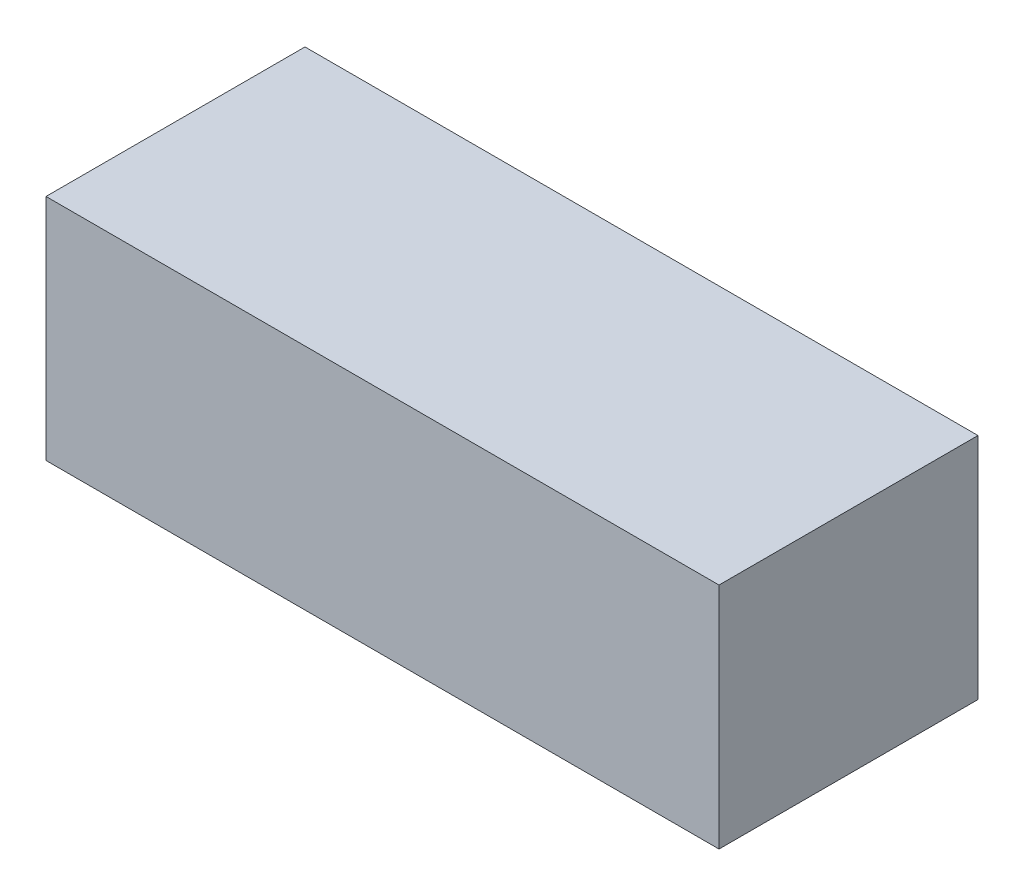
ISO-10303-21;
HEADER;
FILE_DESCRIPTION(('STEP AP214'),'2;1');
FILE_NAME('part.step','',(''),(''),'','','');
FILE_SCHEMA(('AUTOMOTIVE_DESIGN { 1 0 10303 214 1 1 1 1 }'));
ENDSEC;
DATA;
#1=APPLICATION_CONTEXT('core data for automotive mechanical design processes');
#2=APPLICATION_PROTOCOL_DEFINITION('international standard','automotive_design',2000,#1);
#3=PRODUCT_CONTEXT('',#1,'mechanical');
#4=PRODUCT('Part','Part','',(#3));
#5=PRODUCT_RELATED_PRODUCT_CATEGORY('part','',(#4));
#6=PRODUCT_DEFINITION_FORMATION('','',#4);
#7=PRODUCT_DEFINITION_CONTEXT('part definition',#1,'design');
#8=PRODUCT_DEFINITION('design','',#6,#7);
#9=PRODUCT_DEFINITION_SHAPE('','',#8);
#10=(LENGTH_UNIT() NAMED_UNIT(*) SI_UNIT(.MILLI.,.METRE.));
#11=(NAMED_UNIT(*) PLANE_ANGLE_UNIT() SI_UNIT($,.RADIAN.));
#12=(NAMED_UNIT(*) SI_UNIT($,.STERADIAN.) SOLID_ANGLE_UNIT());
#13=UNCERTAINTY_MEASURE_WITH_UNIT(LENGTH_MEASURE(1.E-05),#10,'distance_accuracy_value','');
#14=(GEOMETRIC_REPRESENTATION_CONTEXT(3) GLOBAL_UNCERTAINTY_ASSIGNED_CONTEXT((#13)) GLOBAL_UNIT_ASSIGNED_CONTEXT((#10,
#11,#12)) REPRESENTATION_CONTEXT('',''));
#15=CARTESIAN_POINT('',(0.,0.,0.));
#16=DIRECTION('',(0.,0.,1.));
#17=DIRECTION('',(1.,0.,0.));
#18=AXIS2_PLACEMENT_3D('',#15,#16,#17);
#19=CARTESIAN_POINT('',(0.,20.,0.));
#20=DIRECTION('',(1.,0.,0.));
#21=DIRECTION('',(0.,0.,-1.));
#22=AXIS2_PLACEMENT_3D('',#19,#20,#21);
#23=PLANE('',#22);
#24=DIRECTION('',(0.,0.,1.));
#25=VECTOR('',#24,1.);
#26=CARTESIAN_POINT('',(0.,0.,0.));
#27=LINE('',#26,#25);
#28=CARTESIAN_POINT('',(0.,0.,-22.65));
#29=VERTEX_POINT('',#28);
#30=CARTESIAN_POINT('',(0.,0.,0.));
#31=VERTEX_POINT('',#30);
#32=EDGE_CURVE('E113',#29,#31,#27,.T.);
#33=ORIENTED_EDGE('',*,*,#32,.T.);
#34=DIRECTION('',(0.,-1.,0.));
#35=VECTOR('',#34,1.);
#36=CARTESIAN_POINT('',(0.,20.,0.));
#37=LINE('',#36,#35);
#38=CARTESIAN_POINT('',(0.,20.,0.));
#39=VERTEX_POINT('',#38);
#40=EDGE_CURVE('E11',#39,#31,#37,.T.);
#41=ORIENTED_EDGE('',*,*,#40,.F.);
#42=DIRECTION('',(0.,0.,1.));
#43=VECTOR('',#42,1.);
#44=CARTESIAN_POINT('',(0.,20.,0.));
#45=LINE('',#44,#43);
#46=CARTESIAN_POINT('',(0.,20.,-22.65));
#47=VERTEX_POINT('',#46);
#48=EDGE_CURVE('E97',#47,#39,#45,.T.);
#49=ORIENTED_EDGE('',*,*,#48,.F.);
#50=DIRECTION('',(0.,-1.,0.));
#51=VECTOR('',#50,1.);
#52=CARTESIAN_POINT('',(0.,20.,-22.65));
#53=LINE('',#52,#51);
#54=EDGE_CURVE('E109',#47,#29,#53,.T.);
#55=ORIENTED_EDGE('',*,*,#54,.T.);
#56=EDGE_LOOP('',(#33,#41,#49,#55));
#57=FACE_BOUND('',#56,.T.);
#58=ADVANCED_FACE('F45',(#57),#23,.F.);
#59=CARTESIAN_POINT('',(0.,20.,0.));
#60=DIRECTION('',(0.,0.,-1.));
#61=DIRECTION('',(-1.,0.,0.));
#62=AXIS2_PLACEMENT_3D('',#59,#60,#61);
#63=PLANE('',#62);
#64=DIRECTION('',(1.,0.,0.));
#65=VECTOR('',#64,1.);
#66=CARTESIAN_POINT('',(0.,0.,0.));
#67=LINE('',#66,#65);
#68=CARTESIAN_POINT('',(58.86228,0.,0.));
#69=VERTEX_POINT('',#68);
#70=EDGE_CURVE('E102',#31,#69,#67,.T.);
#71=ORIENTED_EDGE('',*,*,#70,.T.);
#72=DIRECTION('',(0.,-1.,0.));
#73=VECTOR('',#72,1.);
#74=CARTESIAN_POINT('',(58.86228,20.,0.));
#75=LINE('',#74,#73);
#76=CARTESIAN_POINT('',(58.86228,20.,0.));
#77=VERTEX_POINT('',#76);
#78=EDGE_CURVE('E54',#77,#69,#75,.T.);
#79=ORIENTED_EDGE('',*,*,#78,.F.);
#80=DIRECTION('',(1.,0.,0.));
#81=VECTOR('',#80,1.);
#82=CARTESIAN_POINT('',(0.,20.,0.));
#83=LINE('',#82,#81);
#84=EDGE_CURVE('E92',#39,#77,#83,.T.);
#85=ORIENTED_EDGE('',*,*,#84,.F.);
#86=ORIENTED_EDGE('',*,*,#40,.T.);
#87=EDGE_LOOP('',(#71,#79,#85,#86));
#88=FACE_BOUND('',#87,.T.);
#89=ADVANCED_FACE('F101',(#88),#63,.F.);
#90=CARTESIAN_POINT('',(58.86228,20.,0.));
#91=DIRECTION('',(-1.,0.,0.));
#92=DIRECTION('',(0.,0.,1.));
#93=AXIS2_PLACEMENT_3D('',#90,#91,#92);
#94=PLANE('',#93);
#95=DIRECTION('',(0.,0.,-1.));
#96=VECTOR('',#95,1.);
#97=CARTESIAN_POINT('',(58.86228,0.,0.));
#98=LINE('',#97,#96);
#99=CARTESIAN_POINT('',(58.86228,0.,-22.65));
#100=VERTEX_POINT('',#99);
#101=EDGE_CURVE('E79',#69,#100,#98,.T.);
#102=ORIENTED_EDGE('',*,*,#101,.T.);
#103=DIRECTION('',(0.,-1.,0.));
#104=VECTOR('',#103,1.);
#105=CARTESIAN_POINT('',(58.86228,20.,-22.65));
#106=LINE('',#105,#104);
#107=CARTESIAN_POINT('',(58.86228,20.,-22.65));
#108=VERTEX_POINT('',#107);
#109=EDGE_CURVE('E104',#108,#100,#106,.T.);
#110=ORIENTED_EDGE('',*,*,#109,.F.);
#111=DIRECTION('',(0.,0.,-1.));
#112=VECTOR('',#111,1.);
#113=CARTESIAN_POINT('',(58.86228,20.,0.));
#114=LINE('',#113,#112);
#115=EDGE_CURVE('E95',#77,#108,#114,.T.);
#116=ORIENTED_EDGE('',*,*,#115,.F.);
#117=ORIENTED_EDGE('',*,*,#78,.T.);
#118=EDGE_LOOP('',(#102,#110,#116,#117));
#119=FACE_BOUND('',#118,.T.);
#120=ADVANCED_FACE('F105',(#119),#94,.F.);
#121=CARTESIAN_POINT('',(0.,20.,-22.65));
#122=DIRECTION('',(0.,0.,1.));
#123=DIRECTION('',(1.,0.,0.));
#124=AXIS2_PLACEMENT_3D('',#121,#122,#123);
#125=PLANE('',#124);
#126=DIRECTION('',(-1.,0.,0.));
#127=VECTOR('',#126,1.);
#128=CARTESIAN_POINT('',(0.,0.,-22.65));
#129=LINE('',#128,#127);
#130=EDGE_CURVE('E85',#100,#29,#129,.T.);
#131=ORIENTED_EDGE('',*,*,#130,.T.);
#132=ORIENTED_EDGE('',*,*,#54,.F.);
#133=DIRECTION('',(-1.,0.,0.));
#134=VECTOR('',#133,1.);
#135=CARTESIAN_POINT('',(0.,20.,-22.65));
#136=LINE('',#135,#134);
#137=EDGE_CURVE('E62',#108,#47,#136,.T.);
#138=ORIENTED_EDGE('',*,*,#137,.F.);
#139=ORIENTED_EDGE('',*,*,#109,.T.);
#140=EDGE_LOOP('',(#131,#132,#138,#139));
#141=FACE_BOUND('',#140,.T.);
#142=ADVANCED_FACE('F126',(#141),#125,.F.);
#143=CARTESIAN_POINT('',(0.,20.,0.));
#144=DIRECTION('',(0.,-1.,0.));
#145=DIRECTION('',(0.,0.,-1.));
#146=AXIS2_PLACEMENT_3D('',#143,#144,#145);
#147=PLANE('',#146);
#148=ORIENTED_EDGE('',*,*,#48,.T.);
#149=ORIENTED_EDGE('',*,*,#84,.T.);
#150=ORIENTED_EDGE('',*,*,#115,.T.);
#151=ORIENTED_EDGE('',*,*,#137,.T.);
#152=EDGE_LOOP('',(#148,#149,#150,#151));
#153=FACE_BOUND('',#152,.T.);
#154=ADVANCED_FACE('F93',(#153),#147,.F.);
#155=CARTESIAN_POINT('',(0.,0.,0.));
#156=DIRECTION('',(0.,-1.,0.));
#157=DIRECTION('',(0.,0.,-1.));
#158=AXIS2_PLACEMENT_3D('',#155,#156,#157);
#159=PLANE('',#158);
#160=ORIENTED_EDGE('',*,*,#32,.F.);
#161=ORIENTED_EDGE('',*,*,#130,.F.);
#162=ORIENTED_EDGE('',*,*,#101,.F.);
#163=ORIENTED_EDGE('',*,*,#70,.F.);
#164=EDGE_LOOP('',(#160,#161,#162,#163));
#165=FACE_BOUND('',#164,.T.);
#166=ADVANCED_FACE('F129',(#165),#159,.T.);
#167=CLOSED_SHELL('',(#58,#89,#120,#142,#154,#166));
#168=MANIFOLD_SOLID_BREP('B2',#167);
#169=ADVANCED_BREP_SHAPE_REPRESENTATION('',(#18,#168),#14);
#170=SHAPE_DEFINITION_REPRESENTATION(#9,#169);
ENDSEC;
END-ISO-10303-21;
